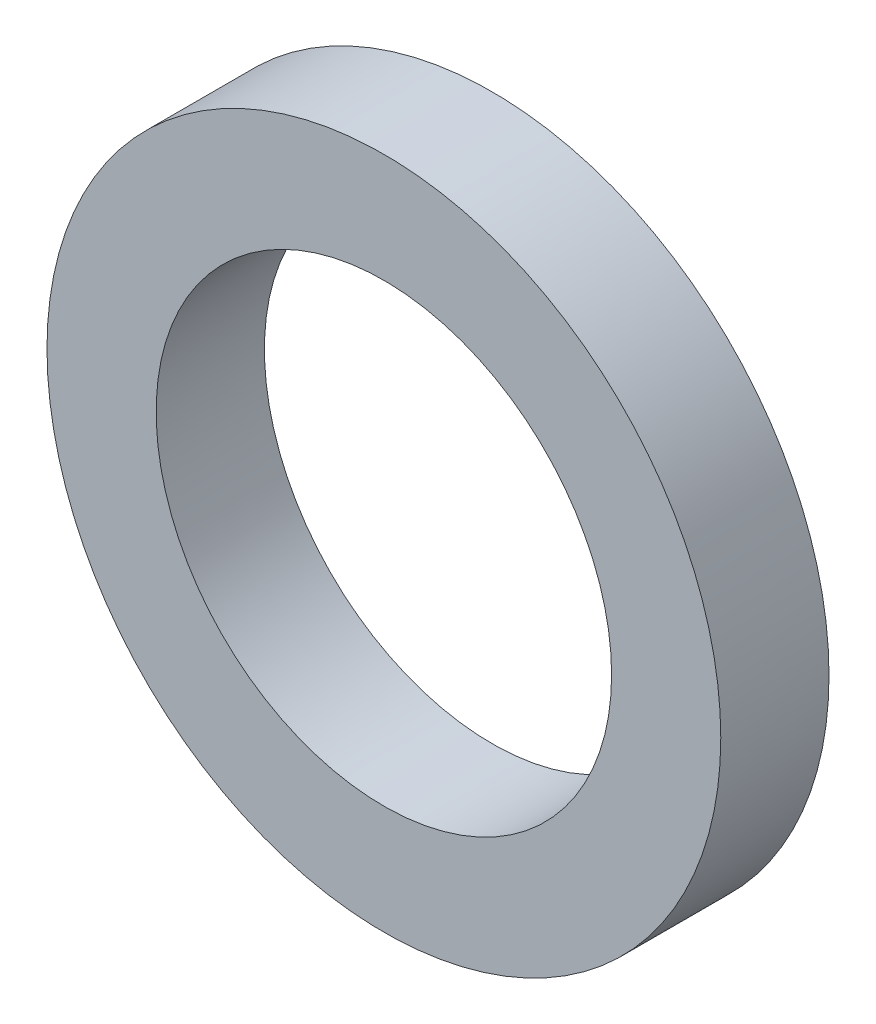
ISO-10303-21;
HEADER;
FILE_DESCRIPTION(('STEP AP214'),'2;1');
FILE_NAME('part.step','',(''),(''),'','','');
FILE_SCHEMA(('AUTOMOTIVE_DESIGN { 1 0 10303 214 1 1 1 1 }'));
ENDSEC;
DATA;
#1=APPLICATION_CONTEXT('core data for automotive mechanical design processes');
#2=APPLICATION_PROTOCOL_DEFINITION('international standard','automotive_design',2000,#1);
#3=PRODUCT_CONTEXT('',#1,'mechanical');
#4=PRODUCT('Part','Part','',(#3));
#5=PRODUCT_RELATED_PRODUCT_CATEGORY('part','',(#4));
#6=PRODUCT_DEFINITION_FORMATION('','',#4);
#7=PRODUCT_DEFINITION_CONTEXT('part definition',#1,'design');
#8=PRODUCT_DEFINITION('design','',#6,#7);
#9=PRODUCT_DEFINITION_SHAPE('','',#8);
#10=(LENGTH_UNIT() NAMED_UNIT(*) SI_UNIT(.MILLI.,.METRE.));
#11=(NAMED_UNIT(*) PLANE_ANGLE_UNIT() SI_UNIT($,.RADIAN.));
#12=(NAMED_UNIT(*) SI_UNIT($,.STERADIAN.) SOLID_ANGLE_UNIT());
#13=UNCERTAINTY_MEASURE_WITH_UNIT(LENGTH_MEASURE(1.E-05),#10,'distance_accuracy_value','');
#14=(GEOMETRIC_REPRESENTATION_CONTEXT(3) GLOBAL_UNCERTAINTY_ASSIGNED_CONTEXT((#13)) GLOBAL_UNIT_ASSIGNED_CONTEXT((#10,
#11,#12)) REPRESENTATION_CONTEXT('',''));
#15=CARTESIAN_POINT('',(0.,0.,0.));
#16=DIRECTION('',(0.,0.,1.));
#17=DIRECTION('',(1.,0.,0.));
#18=AXIS2_PLACEMENT_3D('',#15,#16,#17);
#19=CARTESIAN_POINT('',(0.,0.,12.6));
#20=DIRECTION('',(0.,0.,1.));
#21=DIRECTION('',(1.,0.,0.));
#22=AXIS2_PLACEMENT_3D('',#19,#20,#21);
#23=PLANE('',#22);
#24=CARTESIAN_POINT('',(0.,0.,12.6));
#25=DIRECTION('',(0.,0.,1.));
#26=DIRECTION('',(1.,0.,0.));
#27=AXIS2_PLACEMENT_3D('',#24,#25,#26);
#28=CIRCLE('',#27,39.22);
#29=CARTESIAN_POINT('',(39.22,0.,12.6));
#30=VERTEX_POINT('',#29);
#31=EDGE_CURVE('E10',#30,#30,#28,.T.);
#32=ORIENTED_EDGE('',*,*,#31,.T.);
#33=EDGE_LOOP('',(#32));
#34=FACE_BOUND('',#33,.T.);
#35=CARTESIAN_POINT('',(0.,0.,12.6));
#36=DIRECTION('',(0.,0.,1.));
#37=DIRECTION('',(1.,0.,0.));
#38=AXIS2_PLACEMENT_3D('',#35,#36,#37);
#39=CIRCLE('',#38,26.51);
#40=CARTESIAN_POINT('',(26.51,0.,12.6));
#41=VERTEX_POINT('',#40);
#42=EDGE_CURVE('E42',#41,#41,#39,.T.);
#43=ORIENTED_EDGE('',*,*,#42,.F.);
#44=EDGE_LOOP('',(#43));
#45=FACE_BOUND('',#44,.T.);
#46=ADVANCED_FACE('F31',(#34,#45),#23,.T.);
#47=CARTESIAN_POINT('',(0.,0.,0.));
#48=DIRECTION('',(0.,0.,1.));
#49=DIRECTION('',(1.,0.,0.));
#50=AXIS2_PLACEMENT_3D('',#47,#48,#49);
#51=PLANE('',#50);
#52=CARTESIAN_POINT('',(0.,0.,0.));
#53=DIRECTION('',(0.,0.,1.));
#54=DIRECTION('',(1.,0.,0.));
#55=AXIS2_PLACEMENT_3D('',#52,#53,#54);
#56=CIRCLE('',#55,39.22);
#57=CARTESIAN_POINT('',(39.22,0.,0.));
#58=VERTEX_POINT('',#57);
#59=EDGE_CURVE('E35',#58,#58,#56,.T.);
#60=ORIENTED_EDGE('',*,*,#59,.F.);
#61=EDGE_LOOP('',(#60));
#62=FACE_BOUND('',#61,.T.);
#63=CARTESIAN_POINT('',(0.,0.,0.));
#64=DIRECTION('',(0.,0.,1.));
#65=DIRECTION('',(1.,0.,0.));
#66=AXIS2_PLACEMENT_3D('',#63,#64,#65);
#67=CIRCLE('',#66,26.51);
#68=CARTESIAN_POINT('',(26.51,0.,0.));
#69=VERTEX_POINT('',#68);
#70=EDGE_CURVE('E44',#69,#69,#67,.T.);
#71=ORIENTED_EDGE('',*,*,#70,.T.);
#72=EDGE_LOOP('',(#71));
#73=FACE_BOUND('',#72,.T.);
#74=ADVANCED_FACE('F54',(#62,#73),#51,.F.);
#75=CARTESIAN_POINT('',(0.,0.,12.6));
#76=DIRECTION('',(0.,0.,-1.));
#77=DIRECTION('',(-1.,0.,0.));
#78=AXIS2_PLACEMENT_3D('',#75,#76,#77);
#79=CYLINDRICAL_SURFACE('',#78,39.22);
#80=ORIENTED_EDGE('',*,*,#31,.F.);
#81=EDGE_LOOP('',(#80));
#82=FACE_BOUND('',#81,.T.);
#83=ORIENTED_EDGE('',*,*,#59,.T.);
#84=EDGE_LOOP('',(#83));
#85=FACE_BOUND('',#84,.T.);
#86=ADVANCED_FACE('F33',(#82,#85),#79,.T.);
#87=CARTESIAN_POINT('',(0.,0.,12.6));
#88=DIRECTION('',(0.,0.,-1.));
#89=DIRECTION('',(-1.,0.,0.));
#90=AXIS2_PLACEMENT_3D('',#87,#88,#89);
#91=CYLINDRICAL_SURFACE('',#90,26.51);
#92=ORIENTED_EDGE('',*,*,#42,.T.);
#93=EDGE_LOOP('',(#92));
#94=FACE_BOUND('',#93,.T.);
#95=ORIENTED_EDGE('',*,*,#70,.F.);
#96=EDGE_LOOP('',(#95));
#97=FACE_BOUND('',#96,.T.);
#98=ADVANCED_FACE('F50',(#94,#97),#91,.F.);
#99=CLOSED_SHELL('',(#46,#74,#86,#98));
#100=MANIFOLD_SOLID_BREP('B2',#99);
#101=ADVANCED_BREP_SHAPE_REPRESENTATION('',(#18,#100),#14);
#102=SHAPE_DEFINITION_REPRESENTATION(#9,#101);
ENDSEC;
END-ISO-10303-21;
